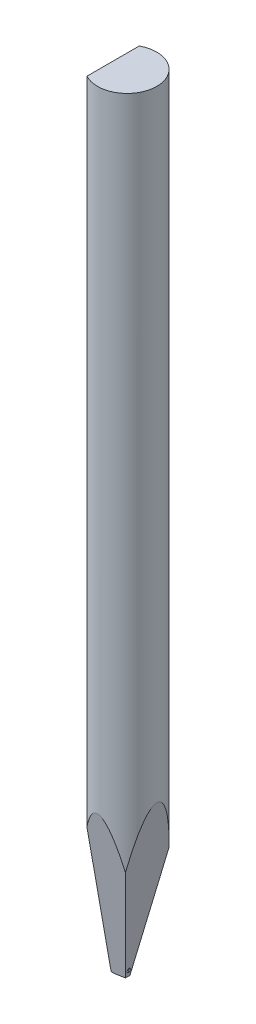
ISO-10303-21;
HEADER;
FILE_DESCRIPTION(('STEP AP214'),'2;1');
FILE_NAME('part.step','',(''),(''),'','','');
FILE_SCHEMA(('AUTOMOTIVE_DESIGN { 1 0 10303 214 1 1 1 1 }'));
ENDSEC;
DATA;
#1=APPLICATION_CONTEXT('core data for automotive mechanical design processes');
#2=APPLICATION_PROTOCOL_DEFINITION('international standard','automotive_design',2000,#1);
#3=PRODUCT_CONTEXT('',#1,'mechanical');
#4=PRODUCT('Part','Part','',(#3));
#5=PRODUCT_RELATED_PRODUCT_CATEGORY('part','',(#4));
#6=PRODUCT_DEFINITION_FORMATION('','',#4);
#7=PRODUCT_DEFINITION_CONTEXT('part definition',#1,'design');
#8=PRODUCT_DEFINITION('design','',#6,#7);
#9=PRODUCT_DEFINITION_SHAPE('','',#8);
#10=(LENGTH_UNIT() NAMED_UNIT(*) SI_UNIT(.MILLI.,.METRE.));
#11=(NAMED_UNIT(*) PLANE_ANGLE_UNIT() SI_UNIT($,.RADIAN.));
#12=(NAMED_UNIT(*) SI_UNIT($,.STERADIAN.) SOLID_ANGLE_UNIT());
#13=UNCERTAINTY_MEASURE_WITH_UNIT(LENGTH_MEASURE(1.E-05),#10,'distance_accuracy_value','');
#14=(GEOMETRIC_REPRESENTATION_CONTEXT(3) GLOBAL_UNCERTAINTY_ASSIGNED_CONTEXT((#13)) GLOBAL_UNIT_ASSIGNED_CONTEXT((#10,
#11,#12)) REPRESENTATION_CONTEXT('',''));
#15=CARTESIAN_POINT('',(0.,0.,0.));
#16=DIRECTION('',(0.,0.,1.));
#17=DIRECTION('',(1.,0.,0.));
#18=AXIS2_PLACEMENT_3D('',#15,#16,#17);
#19=CARTESIAN_POINT('',(26.8738719491216,0.,0.0508));
#20=DIRECTION('',(0.,-0.173648177666931,0.984807753012208));
#21=DIRECTION('',(0.,-0.984807753012208,-0.173648177666931));
#22=AXIS2_PLACEMENT_3D('',#19,#20,#21);
#23=PLANE('',#22);
#24=CARTESIAN_POINT('',(-0.35316,0.02286,0.0548308347789982));
#25=DIRECTION('',(0.,-0.173648177666931,0.984807753012208));
#26=DIRECTION('',(0.,-0.984807753012208,-0.173648177666931));
#27=AXIS2_PLACEMENT_3D('',#24,#25,#26);
#28=ELLIPSE('',#27,0.0232126523477082,0.02286);
#29=CARTESIAN_POINT('',(-0.353160000000002,0.,0.0507920612593779));
#30=VERTEX_POINT('',#29);
#31=CARTESIAN_POINT('',(-0.37592,0.0207241161080222,0.0544542208211788));
#32=VERTEX_POINT('',#31);
#33=EDGE_CURVE('E214',#30,#32,#28,.F.);
#34=ORIENTED_EDGE('',*,*,#33,.F.);
#35=CARTESIAN_POINT('',(-0.287020000000002,0.,0.0507841225187557));
#36=DIRECTION('',(-1.,0.,0.));
#37=VECTOR('',#36,1.);
#38=LINE('',#35,#37);
#39=CARTESIAN_POINT('',(-0.287019999999999,0.,0.0507920612593779));
#40=VERTEX_POINT('',#39);
#41=EDGE_CURVE('E241',#40,#30,#38,.T.);
#42=ORIENTED_EDGE('',*,*,#41,.F.);
#43=DIRECTION('',(-0.984346441568213,-0.173566836012845,-0.0306045161452665));
#44=VECTOR('',#43,1.);
#45=CARTESIAN_POINT('',(26.0301980698046,4.64043560289492,0.869033999030531));
#46=LINE('',#45,#44);
#47=CARTESIAN_POINT('',(0.0144531636701099,0.0531578527145794,0.060173163670107));
#48=VERTEX_POINT('',#47);
#49=EDGE_CURVE('E288',#48,#40,#46,.T.);
#50=ORIENTED_EDGE('',*,*,#49,.F.);
#51=DIRECTION('',(-0.171087869746036,-0.970287525247814,-0.171087869746036));
#52=VECTOR('',#51,1.);
#53=CARTESIAN_POINT('',(0.791557999082992,4.46033837772866,0.837277999082991));
#54=LINE('',#53,#52);
#55=CARTESIAN_POINT('',(0.537041505266774,3.0169036135559,0.582761505266773));
#56=VERTEX_POINT('',#55);
#57=EDGE_CURVE('E285',#56,#48,#54,.T.);
#58=ORIENTED_EDGE('',*,*,#57,.F.);
#59=CARTESIAN_POINT('',(0.,-0.288101116436578,0.));
#60=DIRECTION('',(0.,-0.173648177666931,0.984807753012208));
#61=DIRECTION('',(0.,-0.984807753012208,-0.173648177666931));
#62=AXIS2_PLACEMENT_3D('',#59,#60,#61);
#63=ELLIPSE('',#62,4.56371043248163,0.792479999999998);
#64=CARTESIAN_POINT('',(-0.37592,3.66844093071415,0.69764511322018));
#65=VERTEX_POINT('',#64);
#66=EDGE_CURVE('E289',#56,#65,#63,.T.);
#67=ORIENTED_EDGE('',*,*,#66,.T.);
#68=DIRECTION('',(0.,0.984807753012208,0.173648177666931));
#69=VECTOR('',#68,1.);
#70=CARTESIAN_POINT('',(-0.37592,20.251112252608,3.62161747949059));
#71=LINE('',#70,#69);
#72=EDGE_CURVE('E54',#32,#65,#71,.T.);
#73=ORIENTED_EDGE('',*,*,#72,.F.);
#74=EDGE_LOOP('',(#34,#42,#50,#58,#67,#73));
#75=FACE_BOUND('',#74,.T.);
#76=ADVANCED_FACE('F46',(#75),#23,.T.);
#77=CARTESIAN_POINT('',(26.8738719491216,0.,-0.0508));
#78=DIRECTION('',(0.,-0.173648177666931,-0.984807753012208));
#79=DIRECTION('',(0.,0.984807753012208,-0.173648177666931));
#80=AXIS2_PLACEMENT_3D('',#77,#78,#79);
#81=PLANE('',#80);
#82=CARTESIAN_POINT('',(-0.35316,0.02286,-0.0548308347789982));
#83=DIRECTION('',(0.,-0.173648177666931,-0.984807753012208));
#84=DIRECTION('',(0.,0.984807753012208,-0.173648177666931));
#85=AXIS2_PLACEMENT_3D('',#82,#83,#84);
#86=ELLIPSE('',#85,0.0232126523477082,0.02286);
#87=CARTESIAN_POINT('',(-0.37592,0.0207241161080222,-0.0544542208211793));
#88=VERTEX_POINT('',#87);
#89=CARTESIAN_POINT('',(-0.353160000000002,0.,-0.0507920612593779));
#90=VERTEX_POINT('',#89);
#91=EDGE_CURVE('E173',#88,#90,#86,.F.);
#92=ORIENTED_EDGE('',*,*,#91,.F.);
#93=DIRECTION('',(0.,-0.984807753012208,0.173648177666931));
#94=VECTOR('',#93,1.);
#95=CARTESIAN_POINT('',(-0.37592,20.5255765703836,-3.67001294395617));
#96=LINE('',#95,#94);
#97=CARTESIAN_POINT('',(-0.37592,3.66844093071414,-0.69764511322018));
#98=VERTEX_POINT('',#97);
#99=EDGE_CURVE('E168',#98,#88,#96,.T.);
#100=ORIENTED_EDGE('',*,*,#99,.F.);
#101=CARTESIAN_POINT('',(0.,-0.288101116436578,0.));
#102=DIRECTION('',(0.,-0.173648177666931,-0.984807753012208));
#103=DIRECTION('',(0.,-0.984807753012208,0.173648177666931));
#104=AXIS2_PLACEMENT_3D('',#101,#102,#103);
#105=ELLIPSE('',#104,4.56371043248163,0.792479999999998);
#106=CARTESIAN_POINT('',(0.537041505266774,3.0169036135559,-0.582761505266773));
#107=VERTEX_POINT('',#106);
#108=EDGE_CURVE('E292',#98,#107,#105,.T.);
#109=ORIENTED_EDGE('',*,*,#108,.T.);
#110=DIRECTION('',(0.171087869746036,0.970287525247814,-0.171087869746036));
#111=VECTOR('',#110,1.);
#112=CARTESIAN_POINT('',(0.791557999082992,4.46033837772866,-0.837277999082991));
#113=LINE('',#112,#111);
#114=CARTESIAN_POINT('',(0.0144531636701099,0.0531578527145794,-0.060173163670107));
#115=VERTEX_POINT('',#114);
#116=EDGE_CURVE('E303',#115,#107,#113,.T.);
#117=ORIENTED_EDGE('',*,*,#116,.F.);
#118=DIRECTION('',(0.984346441568213,0.173566836012845,-0.0306045161452665));
#119=VECTOR('',#118,1.);
#120=CARTESIAN_POINT('',(26.0301980698046,4.64043560289492,-0.869033999030531));
#121=LINE('',#120,#119);
#122=CARTESIAN_POINT('',(-0.287019999999999,0.,-0.0507920612593778));
#123=VERTEX_POINT('',#122);
#124=EDGE_CURVE('E306',#123,#115,#121,.T.);
#125=ORIENTED_EDGE('',*,*,#124,.F.);
#126=CARTESIAN_POINT('',(-0.287019999999996,0.,-0.0508000000000001));
#127=DIRECTION('',(-1.,0.,0.));
#128=VECTOR('',#127,1.);
#129=LINE('',#126,#128);
#130=EDGE_CURVE('E236',#123,#90,#129,.T.);
#131=ORIENTED_EDGE('',*,*,#130,.T.);
#132=EDGE_LOOP('',(#92,#100,#109,#117,#125,#131));
#133=FACE_BOUND('',#132,.T.);
#134=ADVANCED_FACE('F326',(#133),#81,.T.);
#135=CARTESIAN_POINT('',(0.,21.0312,0.));
#136=DIRECTION('',(0.,-1.,0.));
#137=DIRECTION('',(0.,0.,-1.));
#138=AXIS2_PLACEMENT_3D('',#135,#136,#137);
#139=CYLINDRICAL_SURFACE('',#138,0.792479999999998);
#140=ORIENTED_EDGE('',*,*,#66,.F.);
#141=CARTESIAN_POINT('',(0.,-0.0288101116436568,0.));
#142=DIRECTION('',(-0.984807753012208,0.173648177666931,0.));
#143=DIRECTION('',(-0.173648177666931,-0.984807753012208,0.));
#144=AXIS2_PLACEMENT_3D('',#141,#142,#143);
#145=ELLIPSE('',#144,4.56371043248164,0.792479999999998);
#146=EDGE_CURVE('E282',#56,#107,#145,.T.);
#147=ORIENTED_EDGE('',*,*,#146,.T.);
#148=ORIENTED_EDGE('',*,*,#108,.F.);
#149=DIRECTION('',(0.,-1.,0.));
#150=VECTOR('',#149,1.);
#151=CARTESIAN_POINT('',(-0.37592,21.0312,-0.69764511322018));
#152=LINE('',#151,#150);
#153=CARTESIAN_POINT('',(-0.37592,21.0312,-0.69764511322018));
#154=VERTEX_POINT('',#153);
#155=EDGE_CURVE('E298',#154,#98,#152,.T.);
#156=ORIENTED_EDGE('',*,*,#155,.F.);
#157=CARTESIAN_POINT('',(0.,21.0312,0.));
#158=DIRECTION('',(0.,1.,0.));
#159=DIRECTION('',(0.,0.,1.));
#160=AXIS2_PLACEMENT_3D('',#157,#158,#159);
#161=CIRCLE('',#160,0.792479999999998);
#162=CARTESIAN_POINT('',(-0.37592,21.0312,0.69764511322018));
#163=VERTEX_POINT('',#162);
#164=EDGE_CURVE('E300',#163,#154,#161,.T.);
#165=ORIENTED_EDGE('',*,*,#164,.F.);
#166=DIRECTION('',(0.,-1.,0.));
#167=VECTOR('',#166,1.);
#168=CARTESIAN_POINT('',(-0.37592,21.0312,0.69764511322018));
#169=LINE('',#168,#167);
#170=EDGE_CURVE('E296',#65,#163,#169,.F.);
#171=ORIENTED_EDGE('',*,*,#170,.F.);
#172=EDGE_LOOP('',(#140,#147,#148,#156,#165,#171));
#173=FACE_BOUND('',#172,.T.);
#174=ADVANCED_FACE('F336',(#173),#139,.T.);
#175=CARTESIAN_POINT('',(-0.37592,21.0312,-0.80247998));
#176=DIRECTION('',(-1.,0.,0.));
#177=DIRECTION('',(0.,0.,1.));
#178=AXIS2_PLACEMENT_3D('',#175,#176,#177);
#179=PLANE('',#178);
#180=CARTESIAN_POINT('',(-0.37592,0.,0.0507841225187557));
#181=CARTESIAN_POINT('',(-0.37592,0.0124912996373636,0.0356119424462526));
#182=CARTESIAN_POINT('',(-0.37592,0.0241300000000007,0.0180052989584167));
#183=CARTESIAN_POINT('',(-0.37592,0.0241300000000007,-0.0180052989584167));
#184=CARTESIAN_POINT('',(-0.37592,0.0124912996373624,-0.0356119424462515));
#185=CARTESIAN_POINT('',(-0.37592,0.,-0.0507841225187556));
#186=(BOUNDED_CURVE() B_SPLINE_CURVE(3,(#180,#181,#182,#183,#184,#185),.UNSPECIFIED.,.F.,
.F.) B_SPLINE_CURVE_WITH_KNOTS((4,2,4),(1.42102999679081,1.5707963267949,1.72056265679899),
.UNSPECIFIED.) CURVE() GEOMETRIC_REPRESENTATION_ITEM() RATIONAL_B_SPLINE_CURVE((1.,1.,1.,1.,1.,1.)) REPRESENTATION_ITEM(''));
#187=CARTESIAN_POINT('',(-0.375960904167992,0.0219255780743327,-0.0173369868293132));
#188=VERTEX_POINT('',#187);
#189=CARTESIAN_POINT('',(-0.375954799312249,0.0218254793366599,0.0175308964824427));
#190=VERTEX_POINT('',#189);
#191=EDGE_CURVE('E155',#188,#190,#186,.F.);
#192=ORIENTED_EDGE('',*,*,#191,.T.);
#193=DIRECTION('',(0.,0.,-1.));
#194=VECTOR('',#193,1.);
#195=CARTESIAN_POINT('',(-0.37592,0.0207241161080225,27.1393987062344));
#196=LINE('',#195,#194);
#197=EDGE_CURVE('E69',#32,#190,#196,.T.);
#198=ORIENTED_EDGE('',*,*,#197,.F.);
#199=ORIENTED_EDGE('',*,*,#72,.T.);
#200=ORIENTED_EDGE('',*,*,#170,.T.);
#201=DIRECTION('',(0.,0.,-1.));
#202=VECTOR('',#201,1.);
#203=CARTESIAN_POINT('',(-0.37592,21.0312,-0.80247998));
#204=LINE('',#203,#202);
#205=EDGE_CURVE('E294',#163,#154,#204,.T.);
#206=ORIENTED_EDGE('',*,*,#205,.T.);
#207=ORIENTED_EDGE('',*,*,#155,.T.);
#208=ORIENTED_EDGE('',*,*,#99,.T.);
#209=EDGE_CURVE('E165',#188,#88,#196,.T.);
#210=ORIENTED_EDGE('',*,*,#209,.F.);
#211=EDGE_LOOP('',(#192,#198,#199,#200,#206,#207,#208,#210));
#212=FACE_BOUND('',#211,.T.);
#213=ADVANCED_FACE('F166',(#212),#179,.T.);
#214=CARTESIAN_POINT('',(0.,21.0312,0.));
#215=DIRECTION('',(0.,1.,0.));
#216=DIRECTION('',(0.,0.,1.));
#217=AXIS2_PLACEMENT_3D('',#214,#215,#216);
#218=PLANE('',#217);
#219=ORIENTED_EDGE('',*,*,#164,.T.);
#220=ORIENTED_EDGE('',*,*,#205,.F.);
#221=EDGE_LOOP('',(#219,#220));
#222=FACE_BOUND('',#221,.T.);
#223=ADVANCED_FACE('F342',(#222),#218,.T.);
#224=CARTESIAN_POINT('',(-0.28702,0.,27.2760283406468));
#225=DIRECTION('',(-0.173648177666931,0.984807753012208,0.));
#226=DIRECTION('',(-0.984807753012208,-0.173648177666931,0.));
#227=AXIS2_PLACEMENT_3D('',#224,#225,#226);
#228=PLANE('',#227);
#229=ORIENTED_EDGE('',*,*,#49,.T.);
#230=CARTESIAN_POINT('',(-2.19568989639233,-0.33655,0.));
#231=DIRECTION('',(-0.173648177666931,0.984807753012208,0.));
#232=DIRECTION('',(-0.984807753012208,-0.173648177666931,0.));
#233=AXIS2_PLACEMENT_3D('',#230,#231,#232);
#234=ELLIPSE('',#233,1.96005512164276,0.34036);
#235=CARTESIAN_POINT('',(-0.272227206716973,0.00260836857582131,0.0285749999999997));
#236=VERTEX_POINT('',#235);
#237=EDGE_CURVE('E247',#40,#236,#234,.T.);
#238=ORIENTED_EDGE('',*,*,#237,.T.);
#239=DIRECTION('',(-0.984807753012208,-0.173648177666931,0.));
#240=VECTOR('',#239,1.);
#241=CARTESIAN_POINT('',(-0.28702,0.,0.0285749999999994));
#242=LINE('',#241,#240);
#243=CARTESIAN_POINT('',(-0.127,0.0282158434529687,0.0285749999999997));
#244=VERTEX_POINT('',#243);
#245=EDGE_CURVE('E314',#244,#236,#242,.T.);
#246=ORIENTED_EDGE('',*,*,#245,.F.);
#247=DIRECTION('',(0.,0.,1.));
#248=VECTOR('',#247,1.);
#249=CARTESIAN_POINT('',(-0.127,0.0282158434529687,27.2760283406468));
#250=LINE('',#249,#248);
#251=CARTESIAN_POINT('',(-0.127,0.0282158434529687,-0.0285749999999997));
#252=VERTEX_POINT('',#251);
#253=EDGE_CURVE('E312',#252,#244,#250,.T.);
#254=ORIENTED_EDGE('',*,*,#253,.F.);
#255=DIRECTION('',(-0.984807753012208,-0.173648177666931,0.));
#256=VECTOR('',#255,1.);
#257=CARTESIAN_POINT('',(-0.28702,0.,-0.0285749999999994));
#258=LINE('',#257,#256);
#259=CARTESIAN_POINT('',(-0.272227206716973,0.00260836857582131,-0.0285749999999997));
#260=VERTEX_POINT('',#259);
#261=EDGE_CURVE('E309',#252,#260,#258,.T.);
#262=ORIENTED_EDGE('',*,*,#261,.T.);
#263=EDGE_CURVE('E221',#260,#123,#234,.T.);
#264=ORIENTED_EDGE('',*,*,#263,.T.);
#265=ORIENTED_EDGE('',*,*,#124,.T.);
#266=DIRECTION('',(0.,0.,-1.));
#267=VECTOR('',#266,1.);
#268=CARTESIAN_POINT('',(0.014453163670107,0.0531578527145792,27.2760283406468));
#269=LINE('',#268,#267);
#270=EDGE_CURVE('E279',#48,#115,#269,.T.);
#271=ORIENTED_EDGE('',*,*,#270,.F.);
#272=EDGE_LOOP('',(#229,#238,#246,#254,#262,#264,#265,#271));
#273=FACE_BOUND('',#272,.T.);
#274=ADVANCED_FACE('F503',(#273),#228,.F.);
#275=CARTESIAN_POINT('',(0.014453163670107,0.0531578527145792,27.2760283406468));
#276=DIRECTION('',(-0.984807753012208,0.173648177666931,0.));
#277=DIRECTION('',(-0.173648177666931,-0.984807753012208,0.));
#278=AXIS2_PLACEMENT_3D('',#275,#276,#277);
#279=PLANE('',#278);
#280=CARTESIAN_POINT('',(0.042417493302163,0.211751446954655,0.));
#281=DIRECTION('',(-0.984807753012208,0.173648177666931,0.));
#282=DIRECTION('',(0.173648177666931,0.984807753012208,0.));
#283=AXIS2_PLACEMENT_3D('',#280,#281,#282);
#284=ELLIPSE('',#283,0.0566555398592854,0.0406948626453099);
#285=CARTESIAN_POINT('',(0.052255624553464,0.267546261859171,0.));
#286=VERTEX_POINT('',#285);
#287=EDGE_CURVE('E277',#286,#286,#284,.F.);
#288=ORIENTED_EDGE('',*,*,#287,.F.);
#289=EDGE_LOOP('',(#288));
#290=FACE_BOUND('',#289,.T.);
#291=ORIENTED_EDGE('',*,*,#146,.F.);
#292=ORIENTED_EDGE('',*,*,#57,.T.);
#293=ORIENTED_EDGE('',*,*,#270,.T.);
#294=ORIENTED_EDGE('',*,*,#116,.T.);
#295=EDGE_LOOP('',(#291,#292,#293,#294));
#296=FACE_BOUND('',#295,.T.);
#297=ADVANCED_FACE('F499',(#290,#296),#279,.F.);
#298=CARTESIAN_POINT('',(-0.22877858413363,0.0965200000000001,0.));
#299=DIRECTION('',(-0.500000000000004,-0.866025403784436,0.));
#300=DIRECTION('',(0.866025403784436,-0.500000000000004,0.));
#301=AXIS2_PLACEMENT_3D('',#298,#299,#300);
#302=CYLINDRICAL_SURFACE('',#301,0.028575);
#303=DIRECTION('',(-0.500000000000004,-0.866025403784436,0.));
#304=VECTOR('',#303,1.);
#305=CARTESIAN_POINT('',(-0.213378324086859,0.12319403285078,0.028575));
#306=LINE('',#305,#304);
#307=CARTESIAN_POINT('',(-0.22877858413363,0.0965200000000001,0.028575));
#308=VERTEX_POINT('',#307);
#309=CARTESIAN_POINT('',(-0.282998489816425,0.00260836857580754,0.028575));
#310=VERTEX_POINT('',#309);
#311=EDGE_CURVE('E274',#308,#310,#306,.T.);
#312=ORIENTED_EDGE('',*,*,#311,.T.);
#313=CARTESIAN_POINT('',(-0.282998489816427,0.00260836857580264,-0.028575));
#314=CARTESIAN_POINT('',(-0.291057954934873,0.00727750260510659,-0.0285750000000002));
#315=CARTESIAN_POINT('',(-0.297553297601773,0.00979968639561033,-0.0246185446540711));
#316=CARTESIAN_POINT('',(-0.306882221783249,0.0131243082575393,-0.0139838160543526));
#317=CARTESIAN_POINT('',(-0.309458673133645,0.0139673876968948,-0.00698118055188267));
#318=CARTESIAN_POINT('',(-0.309409884530429,0.0139726401064735,0.00714153323061982));
#319=CARTESIAN_POINT('',(-0.30680470638007,0.0131325634305108,0.0140922105999724));
#320=CARTESIAN_POINT('',(-0.297454069961335,0.00980772083814176,0.0246677652429086));
#321=CARTESIAN_POINT('',(-0.291024965217658,0.00726516076959005,0.0285750000000008));
#322=CARTESIAN_POINT('',(-0.282998489816425,0.00260836857580259,0.028575));
#323=(BOUNDED_CURVE() B_SPLINE_CURVE(3,(#313,#314,#315,#316,#317,#318,#319,#320,#321,#322),
.UNSPECIFIED.,.F.,.F.) B_SPLINE_CURVE_WITH_KNOTS((4,2,2,2,4),(0.,2.38139585135671E-05,
4.76279170271342E-05,7.14418755407013E-05,9.52558340542684E-05),
.UNSPECIFIED.) CURVE() GEOMETRIC_REPRESENTATION_ITEM() RATIONAL_B_SPLINE_CURVE((1.,1.,1.,1.,1.,
1.,1.,1.,1.,1.)) REPRESENTATION_ITEM(''));
#324=CARTESIAN_POINT('',(-0.282998489816422,0.00260836857580448,-0.028575));
#325=VERTEX_POINT('',#324);
#326=EDGE_CURVE('E369',#310,#325,#323,.F.);
#327=ORIENTED_EDGE('',*,*,#326,.T.);
#328=DIRECTION('',(0.500000000000004,0.866025403784436,0.));
#329=VECTOR('',#328,1.);
#330=CARTESIAN_POINT('',(-0.22877858413363,0.0965200000000001,-0.028575));
#331=LINE('',#330,#329);
#332=CARTESIAN_POINT('',(-0.22877858413363,0.0965200000000001,-0.028575));
#333=VERTEX_POINT('',#332);
#334=EDGE_CURVE('E278',#325,#333,#331,.T.);
#335=ORIENTED_EDGE('',*,*,#334,.T.);
#336=CARTESIAN_POINT('',(-0.22877858413363,0.0965200000000001,0.));
#337=DIRECTION('',(0.,-1.,0.));
#338=DIRECTION('',(-1.,0.,0.));
#339=AXIS2_PLACEMENT_3D('',#336,#337,#338);
#340=ELLIPSE('',#339,0.0329955678841872,0.028575);
#341=EDGE_CURVE('E275',#333,#308,#340,.F.);
#342=ORIENTED_EDGE('',*,*,#341,.T.);
#343=EDGE_LOOP('',(#312,#327,#335,#342));
#344=FACE_BOUND('',#343,.T.);
#345=ADVANCED_FACE('F486',(#344),#302,.F.);
#346=CARTESIAN_POINT('',(-0.127,0.0965200000000001,0.028575));
#347=DIRECTION('',(-1.,0.,0.));
#348=DIRECTION('',(0.,0.,1.));
#349=AXIS2_PLACEMENT_3D('',#346,#347,#348);
#350=PLANE('',#349);
#351=ORIENTED_EDGE('',*,*,#253,.T.);
#352=DIRECTION('',(0.,1.,0.));
#353=VECTOR('',#352,1.);
#354=CARTESIAN_POINT('',(-0.127,0.0965200000000001,0.028575));
#355=LINE('',#354,#353);
#356=CARTESIAN_POINT('',(-0.127,0.0965200000000001,0.028575));
#357=VERTEX_POINT('',#356);
#358=EDGE_CURVE('E264',#244,#357,#355,.T.);
#359=ORIENTED_EDGE('',*,*,#358,.T.);
#360=DIRECTION('',(0.,0.,-1.));
#361=VECTOR('',#360,1.);
#362=CARTESIAN_POINT('',(-0.127,0.0965200000000001,0.028575));
#363=LINE('',#362,#361);
#364=CARTESIAN_POINT('',(-0.127,0.0965200000000001,0.0254));
#365=VERTEX_POINT('',#364);
#366=EDGE_CURVE('E271',#357,#365,#363,.T.);
#367=ORIENTED_EDGE('',*,*,#366,.T.);
#368=CARTESIAN_POINT('',(-0.127,0.09652,0.));
#369=DIRECTION('',(1.,0.,0.));
#370=DIRECTION('',(0.,1.,0.));
#371=AXIS2_PLACEMENT_3D('',#368,#369,#370);
#372=ELLIPSE('',#371,0.0293293936748329,0.0254);
#373=CARTESIAN_POINT('',(-0.127,0.0965200000000001,-0.0253999999999983));
#374=VERTEX_POINT('',#373);
#375=EDGE_CURVE('E257',#374,#365,#372,.F.);
#376=ORIENTED_EDGE('',*,*,#375,.F.);
#377=CARTESIAN_POINT('',(-0.127,0.0965200000000001,-0.028575));
#378=VERTEX_POINT('',#377);
#379=EDGE_CURVE('E267',#374,#378,#363,.T.);
#380=ORIENTED_EDGE('',*,*,#379,.T.);
#381=DIRECTION('',(0.,1.,0.));
#382=VECTOR('',#381,1.);
#383=CARTESIAN_POINT('',(-0.127,0.0965200000000001,-0.028575));
#384=LINE('',#383,#382);
#385=EDGE_CURVE('E265',#252,#378,#384,.T.);
#386=ORIENTED_EDGE('',*,*,#385,.F.);
#387=EDGE_LOOP('',(#351,#359,#367,#376,#380,#386));
#388=FACE_BOUND('',#387,.T.);
#389=ADVANCED_FACE('F498',(#388),#350,.T.);
#390=CARTESIAN_POINT('',(0.,0.,0.028575));
#391=DIRECTION('',(0.,0.,-1.));
#392=DIRECTION('',(-1.,0.,0.));
#393=AXIS2_PLACEMENT_3D('',#390,#391,#392);
#394=PLANE('',#393);
#395=DIRECTION('',(-1.,0.,0.));
#396=VECTOR('',#395,1.);
#397=CARTESIAN_POINT('',(26.7627469491216,0.00260836857580255,0.028575));
#398=LINE('',#397,#396);
#399=EDGE_CURVE('E244',#310,#236,#398,.F.);
#400=ORIENTED_EDGE('',*,*,#399,.F.);
#401=ORIENTED_EDGE('',*,*,#311,.F.);
#402=DIRECTION('',(-1.,0.,0.));
#403=VECTOR('',#402,1.);
#404=CARTESIAN_POINT('',(-0.261774152017817,0.0965200000000001,0.028575));
#405=LINE('',#404,#403);
#406=EDGE_CURVE('E261',#357,#308,#405,.T.);
#407=ORIENTED_EDGE('',*,*,#406,.F.);
#408=ORIENTED_EDGE('',*,*,#358,.F.);
#409=ORIENTED_EDGE('',*,*,#245,.T.);
#410=EDGE_LOOP('',(#400,#401,#407,#408,#409));
#411=FACE_BOUND('',#410,.T.);
#412=ADVANCED_FACE('F531',(#411),#394,.T.);
#413=CARTESIAN_POINT('',(0.,0.,-0.028575));
#414=DIRECTION('',(0.,0.,-1.));
#415=DIRECTION('',(-1.,0.,0.));
#416=AXIS2_PLACEMENT_3D('',#413,#414,#415);
#417=PLANE('',#416);
#418=ORIENTED_EDGE('',*,*,#334,.F.);
#419=DIRECTION('',(-1.,0.,0.));
#420=VECTOR('',#419,1.);
#421=CARTESIAN_POINT('',(26.7627469491216,0.00260836857580255,-0.028575));
#422=LINE('',#421,#420);
#423=EDGE_CURVE('E317',#325,#260,#422,.F.);
#424=ORIENTED_EDGE('',*,*,#423,.T.);
#425=ORIENTED_EDGE('',*,*,#261,.F.);
#426=ORIENTED_EDGE('',*,*,#385,.T.);
#427=DIRECTION('',(-1.,0.,0.));
#428=VECTOR('',#427,1.);
#429=CARTESIAN_POINT('',(-0.261774152017817,0.0965200000000001,-0.028575));
#430=LINE('',#429,#428);
#431=EDGE_CURVE('E260',#378,#333,#430,.T.);
#432=ORIENTED_EDGE('',*,*,#431,.T.);
#433=EDGE_LOOP('',(#418,#424,#425,#426,#432));
#434=FACE_BOUND('',#433,.T.);
#435=ADVANCED_FACE('F521',(#434),#417,.F.);
#436=CARTESIAN_POINT('',(0.0123245522071936,0.176959067721546,0.));
#437=DIRECTION('',(0.866025403784441,0.499999999999995,0.));
#438=DIRECTION('',(-0.499999999999995,0.866025403784441,0.));
#439=AXIS2_PLACEMENT_3D('',#436,#437,#438);
#440=CONICAL_SURFACE('',#439,0.0254,0.392699081698725);
#441=CARTESIAN_POINT('',(0.0123245522071936,0.176959067721546,0.));
#442=DIRECTION('',(0.866025403784441,0.499999999999995,0.));
#443=DIRECTION('',(-0.499999999999995,0.866025403784441,0.));
#444=AXIS2_PLACEMENT_3D('',#441,#442,#443);
#445=CIRCLE('',#444,0.0254);
#446=CARTESIAN_POINT('',(-0.000375447792806306,0.198956112977671,0.));
#447=VERTEX_POINT('',#446);
#448=EDGE_CURVE('E251',#447,#447,#445,.T.);
#449=ORIENTED_EDGE('',*,*,#448,.F.);
#450=EDGE_LOOP('',(#449));
#451=FACE_BOUND('',#450,.T.);
#452=ORIENTED_EDGE('',*,*,#287,.T.);
#453=EDGE_LOOP('',(#452));
#454=FACE_BOUND('',#453,.T.);
#455=ADVANCED_FACE('F543',(#451,#454),#440,.F.);
#456=CARTESIAN_POINT('',(-0.261774152017817,0.0965200000000001,0.028575));
#457=DIRECTION('',(0.,-1.,0.));
#458=DIRECTION('',(0.,0.,-1.));
#459=AXIS2_PLACEMENT_3D('',#456,#457,#458);
#460=PLANE('',#459);
#461=ORIENTED_EDGE('',*,*,#431,.F.);
#462=ORIENTED_EDGE('',*,*,#379,.F.);
#463=CARTESIAN_POINT('',(-0.127,0.0965200000000001,0.));
#464=DIRECTION('',(0.,1.,0.));
#465=DIRECTION('',(1.,0.,0.));
#466=AXIS2_PLACEMENT_3D('',#463,#464,#465);
#467=ELLIPSE('',#466,0.0508000000000004,0.0254);
#468=EDGE_CURVE('E254',#365,#374,#467,.F.);
#469=ORIENTED_EDGE('',*,*,#468,.F.);
#470=ORIENTED_EDGE('',*,*,#366,.F.);
#471=ORIENTED_EDGE('',*,*,#406,.T.);
#472=ORIENTED_EDGE('',*,*,#341,.F.);
#473=EDGE_LOOP('',(#461,#462,#469,#470,#471,#472));
#474=FACE_BOUND('',#473,.T.);
#475=ADVANCED_FACE('F500',(#474),#460,.T.);
#476=CARTESIAN_POINT('',(-0.38750310314659,-0.0538815367264147,0.));
#477=DIRECTION('',(0.866025403784441,0.499999999999995,0.));
#478=DIRECTION('',(-0.499999999999995,0.866025403784441,0.));
#479=AXIS2_PLACEMENT_3D('',#476,#477,#478);
#480=CYLINDRICAL_SURFACE('',#479,0.0254);
#481=ORIENTED_EDGE('',*,*,#375,.T.);
#482=ORIENTED_EDGE('',*,*,#468,.T.);
#483=EDGE_LOOP('',(#481,#482));
#484=FACE_BOUND('',#483,.T.);
#485=ORIENTED_EDGE('',*,*,#448,.T.);
#486=EDGE_LOOP('',(#485));
#487=FACE_BOUND('',#486,.T.);
#488=ADVANCED_FACE('F537',(#484,#487),#480,.F.);
#489=CARTESIAN_POINT('',(26.7627469491216,-0.33655,0.));
#490=DIRECTION('',(-1.,0.,0.));
#491=DIRECTION('',(0.,0.,1.));
#492=AXIS2_PLACEMENT_3D('',#489,#490,#491);
#493=CYLINDRICAL_SURFACE('',#492,0.34036);
#494=ORIENTED_EDGE('',*,*,#41,.T.);
#495=CARTESIAN_POINT('',(-0.35316,0.,0.0507841225187487));
#496=CARTESIAN_POINT('',(-0.353373732251372,-9.9345582125882E-08,0.0507847439070903));
#497=CARTESIAN_POINT('',(-0.353586598537425,2.9933462318433E-06,0.0507642873292754));
#498=CARTESIAN_POINT('',(-0.354002742092885,1.46301891653247E-05,0.0506870964390786));
#499=CARTESIAN_POINT('',(-0.354206108342231,2.31025416714583E-05,0.0506308399024754));
#500=CARTESIAN_POINT('',(-0.354656535219782,4.76179327962753E-05,0.0504676252112719));
#501=CARTESIAN_POINT('',(-0.354899897489881,6.51160825404775E-05,0.0503508841630334));
#502=CARTESIAN_POINT('',(-0.355365694595863,0.000105452460850597,0.0500804851487046));
#503=CARTESIAN_POINT('',(-0.355588001118319,0.000128320802153074,0.0499266188682787));
#504=CARTESIAN_POINT('',(-0.356167445330495,0.000195645530246311,0.0494710360603362));
#505=CARTESIAN_POINT('',(-0.356503754728676,0.00024362549723817,0.0491437041807785));
#506=CARTESIAN_POINT('',(-0.357126804482206,0.000344632628413951,0.0484465068439318));
#507=CARTESIAN_POINT('',(-0.357413434035267,0.000397670675827903,0.0480765492983261));
#508=CARTESIAN_POINT('',(-0.358478057636995,0.000611918919671937,0.0465623363900981));
#509=CARTESIAN_POINT('',(-0.359116311865306,0.000781127617140636,0.0453235022218624));
#510=CARTESIAN_POINT('',(-0.360230597221551,0.00111402197564509,0.042774553102763));
#511=CARTESIAN_POINT('',(-0.360705465248353,0.00127766085635154,0.0414640010669976));
#512=CARTESIAN_POINT('',(-0.362684568080408,0.0020081188208258,0.0353085475165155));
#513=CARTESIAN_POINT('',(-0.363595230582203,0.00249838071774296,0.0302703322572376));
#514=CARTESIAN_POINT('',(-0.364923321586658,0.00325235849537647,0.020141907139426));
#515=CARTESIAN_POINT('',(-0.365340089826931,0.00351577098433968,0.0150516368339619));
#516=CARTESIAN_POINT('',(-0.365878267938912,0.00385767780351296,0.00332616977081136));
#517=CARTESIAN_POINT('',(-0.365875430768373,0.00385816517747613,-0.00331950750880195));
#518=CARTESIAN_POINT('',(-0.365366639149005,0.00353105773718187,-0.0145204520289741));
#519=CARTESIAN_POINT('',(-0.365016484477494,0.00330483640163298,-0.019086857749717));
#520=CARTESIAN_POINT('',(-0.36407840338286,0.00277102331687769,-0.026759049778636));
#521=CARTESIAN_POINT('',(-0.36359728865163,0.00251012962693596,-0.0298804408246669));
#522=CARTESIAN_POINT('',(-0.362524530272293,0.00200013822946934,-0.0351192845198816));
#523=CARTESIAN_POINT('',(-0.362011133605511,0.00177163215710648,-0.0372530605981551));
#524=CARTESIAN_POINT('',(-0.360932418030966,0.00135694241051406,-0.0408173817217836));
#525=CARTESIAN_POINT('',(-0.360428019903359,0.00117840123560602,-0.0422682298446862));
#526=CARTESIAN_POINT('',(-0.359184244140823,0.000796369329998768,-0.0452175970915375));
#527=CARTESIAN_POINT('',(-0.358429807165561,0.000592015364295269,-0.046711233260249));
#528=CARTESIAN_POINT('',(-0.357239309854852,0.000366162246898982,-0.048296030820931));
#529=CARTESIAN_POINT('',(-0.357033326137489,0.000329480471812337,-0.0485510884269556));
#530=CARTESIAN_POINT('',(-0.356595963389539,0.000258571889497027,-0.0490405428510718));
#531=CARTESIAN_POINT('',(-0.356364510869427,0.00022435268408738,-0.0492748761646582));
#532=CARTESIAN_POINT('',(-0.355868337270201,0.000159605918410828,-0.049715405864434));
#533=CARTESIAN_POINT('',(-0.355603143126216,0.000129146188242266,-0.0499210920432127));
#534=CARTESIAN_POINT('',(-0.355040250662018,7.57279632840068E-05,-0.050280029959809));
#535=CARTESIAN_POINT('',(-0.354742858691519,5.27058583383511E-05,-0.0504337268986214));
#536=CARTESIAN_POINT('',(-0.354229464405265,2.41515479786925E-05,-0.0506238713433833));
#537=CARTESIAN_POINT('',(-0.35402202926594,1.53119510561065E-05,-0.0506825715908233));
#538=CARTESIAN_POINT('',(-0.353596797994717,3.13995531593212E-06,-0.0507633158270858));
#539=CARTESIAN_POINT('',(-0.353378891319249,-1.05274283725804E-07,-0.0507847796446884));
#540=CARTESIAN_POINT('',(-0.353160000019582,-5.2931626408195E-12,-0.0507841225707873));
#541=B_SPLINE_CURVE_WITH_KNOTS('',3,(#495,#496,#497,#498,#499,#500,#501,#502,#503,#504,#505,
#506,#507,#508,#509,#510,#511,#512,#513,#514,#515,#516,#517,#518,#519,#520,#521,#522,#523,#524,
#525,#526,#527,#528,#529,#530,#531,#532,#533,#534,#535,#536,#537,#538,#539,#540),.UNSPECIFIED.,
.F.,.F.,(4,2,2,2,2,2,2,2,2,2,2,2,2,2,2,2,2,2,2,2,2,2,4),(0.,0.000638802240630786,
0.00126925305763175,0.00207613009026001,0.00288764443873067,0.00429491791191493,
0.00570529076795616,0.00988377805642201,0.0140914235654482,0.0294114096160041,
0.0447518531638898,0.0646417067345851,0.0783830095080341,0.0878810608792403,0.0944873828847801,
0.0991276753758563,0.104123988154376,0.105112374065861,0.1061036906753,0.107110869108363,
0.108109190431913,0.108753248673409,0.109407254603344),.UNSPECIFIED.);
#542=CARTESIAN_POINT('',(-0.36366346878511,0.00256366392580253,0.0290966972665005));
#543=VERTEX_POINT('',#542);
#544=EDGE_CURVE('E172',#30,#543,#541,.T.);
#545=ORIENTED_EDGE('',*,*,#544,.T.);
#546=CARTESIAN_POINT('',(-0.37592,0.,-0.0507841225187556));
#547=CARTESIAN_POINT('',(-0.365758080833375,0.00253508631817922,-0.0339839247784472));
#548=CARTESIAN_POINT('',(-0.355599999999994,0.00380999999999997,-0.0169914649143359));
#549=CARTESIAN_POINT('',(-0.355599999999994,0.00380999999999996,0.0169914649143359));
#550=CARTESIAN_POINT('',(-0.365758080833375,0.00253508631817924,0.0339839247784471));
#551=CARTESIAN_POINT('',(-0.37592,0.,0.0507841225187557));
#552=(BOUNDED_CURVE() B_SPLINE_CURVE(3,(#546,#547,#548,#549,#550,#551),.UNSPECIFIED.,.F.,
.F.) B_SPLINE_CURVE_WITH_KNOTS((4,2,4),(1.42102999679081,1.5707963267949,1.72056265679899),
.UNSPECIFIED.) CURVE() GEOMETRIC_REPRESENTATION_ITEM() RATIONAL_B_SPLINE_CURVE((1.,1.,1.,1.,1.,1.)) REPRESENTATION_ITEM(''));
#553=CARTESIAN_POINT('',(-0.363663424344935,0.00256366234237023,-0.029096715743886));
#554=VERTEX_POINT('',#553);
#555=EDGE_CURVE('E161',#543,#554,#552,.F.);
#556=ORIENTED_EDGE('',*,*,#555,.T.);
#557=EDGE_CURVE('E177',#554,#90,#541,.T.);
#558=ORIENTED_EDGE('',*,*,#557,.T.);
#559=ORIENTED_EDGE('',*,*,#130,.F.);
#560=ORIENTED_EDGE('',*,*,#263,.F.);
#561=ORIENTED_EDGE('',*,*,#423,.F.);
#562=CARTESIAN_POINT('',(-0.282998489816425,0.00260836857580259,0.028575));
#563=CARTESIAN_POINT('',(-0.29102255863418,0.00221755981884332,0.0332135322987013));
#564=CARTESIAN_POINT('',(-0.30185650357803,0.0022400805970294,0.0330958620083343));
#565=CARTESIAN_POINT('',(-0.320183586112597,0.00311904698396301,0.0223381582503345));
#566=CARTESIAN_POINT('',(-0.326994835670755,0.00380563943309761,0.0115288461768746));
#567=CARTESIAN_POINT('',(-0.327068855863113,0.00381431132404127,-0.0112699230251986));
#568=CARTESIAN_POINT('',(-0.320296392575128,0.00313056384670817,-0.0221747468136123));
#569=CARTESIAN_POINT('',(-0.301981797844341,0.00224694405598332,-0.0330338546009608));
#570=CARTESIAN_POINT('',(-0.291059100214688,0.00221626932534044,-0.0332288492425721));
#571=CARTESIAN_POINT('',(-0.282998489816427,0.00260836857580264,-0.028575));
#572=(BOUNDED_CURVE() B_SPLINE_CURVE(3,(#562,#563,#564,#565,#566,#567,#568,#569,#570,#571),
.UNSPECIFIED.,.F.,.F.) B_SPLINE_CURVE_WITH_KNOTS((4,2,2,2,4),(0.,2.38139585135671E-05,
4.76279170271342E-05,7.14418755407013E-05,9.52558340542684E-05),
.UNSPECIFIED.) CURVE() GEOMETRIC_REPRESENTATION_ITEM() RATIONAL_B_SPLINE_CURVE((1.,1.,1.,1.,1.,
1.,1.,1.,1.,1.)) REPRESENTATION_ITEM(''));
#573=EDGE_CURVE('E368',#325,#310,#572,.F.);
#574=ORIENTED_EDGE('',*,*,#573,.T.);
#575=ORIENTED_EDGE('',*,*,#399,.T.);
#576=ORIENTED_EDGE('',*,*,#237,.F.);
#577=EDGE_LOOP('',(#494,#545,#556,#558,#559,#560,#561,#574,#575,#576));
#578=FACE_BOUND('',#577,.T.);
#579=ADVANCED_FACE('F190',(#578),#493,.F.);
#580=CARTESIAN_POINT('',(-0.282998489816425,0.00260836857580259,0.028575));
#581=CARTESIAN_POINT('',(-0.291024965217658,0.00726516076959005,0.0285750000000008));
#582=CARTESIAN_POINT('',(-0.297454069961335,0.00980772083814176,0.0246677652429086));
#583=CARTESIAN_POINT('',(-0.30680470638007,0.0131325634305108,0.0140922105999724));
#584=CARTESIAN_POINT('',(-0.309409884530429,0.0139726401064735,0.00714153323061982));
#585=CARTESIAN_POINT('',(-0.309458673133645,0.0139673876968948,-0.00698118055188267));
#586=CARTESIAN_POINT('',(-0.306882221783249,0.0131243082575393,-0.0139838160543526));
#587=CARTESIAN_POINT('',(-0.297553297601773,0.00979968639561033,-0.0246185446540711));
#588=CARTESIAN_POINT('',(-0.291057954934873,0.00727750260510659,-0.0285750000000002));
#589=CARTESIAN_POINT('',(-0.282998489816427,0.00260836857580264,-0.028575));
#590=CARTESIAN_POINT('',(-0.282998489816425,0.00260836857580259,0.028575));
#591=CARTESIAN_POINT('',(-0.290256962758143,0.00260876055560382,0.0285741662095657));
#592=CARTESIAN_POINT('',(-0.298361929050095,0.00287957069673183,0.0265346542955306));
#593=CARTESIAN_POINT('',(-0.310904887738004,0.003500595847221,0.0164549899921433));
#594=CARTESIAN_POINT('',(-0.315270052831379,0.00380799896315155,0.0083748538469757));
#595=CARTESIAN_POINT('',(-0.315330198104895,0.0038119785269261,-0.00818587207914023));
#596=CARTESIAN_POINT('',(-0.310998778864618,0.00350612718148821,-0.0163355095917579));
#597=CARTESIAN_POINT('',(-0.298471776178693,0.00288331781779211,-0.0264894153475499));
#598=CARTESIAN_POINT('',(-0.290288305336967,0.00260871264191725,-0.0285747525397327));
#599=CARTESIAN_POINT('',(-0.282998489816427,0.00260836857580264,-0.028575));
#600=CARTESIAN_POINT('',(-0.282998489816425,0.00260836857580259,0.028575));
#601=CARTESIAN_POINT('',(-0.29102255863418,0.00221755981884332,0.0332135322987013));
#602=CARTESIAN_POINT('',(-0.30185650357803,0.0022400805970294,0.0330958620083343));
#603=CARTESIAN_POINT('',(-0.320183586112597,0.00311904698396301,0.0223381582503345));
#604=CARTESIAN_POINT('',(-0.326994835670755,0.00380563943309761,0.0115288461768746));
#605=CARTESIAN_POINT('',(-0.327068855863113,0.00381431132404127,-0.0112699230251986));
#606=CARTESIAN_POINT('',(-0.320296392575128,0.00313056384670817,-0.0221747468136123));
#607=CARTESIAN_POINT('',(-0.301981797844341,0.00224694405598332,-0.0330338546009608));
#608=CARTESIAN_POINT('',(-0.291059100214688,0.00221626932534044,-0.0332288492425721));
#609=CARTESIAN_POINT('',(-0.282998489816427,0.00260836857580264,-0.028575));
#610=(BOUNDED_SURFACE() B_SPLINE_SURFACE(2,3,((#580,#581,#582,#583,#584,#585,#586,#587,#588,
#589),(#590,#591,#592,#593,#594,#595,#596,#597,#598,#599),(#600,#601,#602,#603,#604,#605,#606,
#607,#608,#609)),.UNSPECIFIED.,.F.,.F.,.F.) B_SPLINE_SURFACE_WITH_KNOTS((3,3),(4,2,2,2,4),(0.,
1.),(0.,2.38139585135671E-05,4.76279170271342E-05,7.14418755407013E-05,9.52558340542684E-05),
.UNSPECIFIED.) GEOMETRIC_REPRESENTATION_ITEM() RATIONAL_B_SPLINE_SURFACE(((1.,1.,1.,1.,1.,1.,1.,
1.,1.,1.),(0.736191287601447,0.79543778840439,0.82530384819547,0.860781274302784,
0.865976760447274,0.866073506092027,0.860951495617504,0.825623070257616,0.795671165272373,
0.736191287601458),(1.,1.,1.,1.,1.,1.,1.,1.,1.,1.))) REPRESENTATION_ITEM('') SURFACE());
#611=ORIENTED_EDGE('',*,*,#326,.F.);
#612=ORIENTED_EDGE('',*,*,#573,.F.);
#613=EDGE_LOOP('',(#611,#612));
#614=FACE_BOUND('',#613,.T.);
#615=ADVANCED_FACE('F405',(#614),#610,.T.);
#616=CARTESIAN_POINT('',(-0.37592,0.,0.0507841225187557));
#617=CARTESIAN_POINT('',(-0.365758080833375,0.00253508631817924,0.0339839247784471));
#618=CARTESIAN_POINT('',(-0.355599999999994,0.00380999999999996,0.0169914649143359));
#619=CARTESIAN_POINT('',(-0.355599999999994,0.00380999999999997,-0.0169914649143359));
#620=CARTESIAN_POINT('',(-0.365758080833375,0.00253508631817922,-0.0339839247784472));
#621=CARTESIAN_POINT('',(-0.37592,0.,-0.0507841225187556));
#622=CARTESIAN_POINT('',(-0.37592,0.,0.0507841225187557));
#623=CARTESIAN_POINT('',(-0.37591999999996,0.002535257478776,0.0339827897615115));
#624=CARTESIAN_POINT('',(-0.375920000000001,0.00380999999999416,0.0169914649143352));
#625=CARTESIAN_POINT('',(-0.375920000000001,0.00380999999999416,-0.0169914649143352));
#626=CARTESIAN_POINT('',(-0.375919999999957,0.0025352574787778,-0.0339827897615116));
#627=CARTESIAN_POINT('',(-0.37592,0.,-0.0507841225187556));
#628=CARTESIAN_POINT('',(-0.37592,0.,0.0507841225187557));
#629=CARTESIAN_POINT('',(-0.37592,0.0124912996373636,0.0356119424462526));
#630=CARTESIAN_POINT('',(-0.37592,0.0241300000000007,0.0180052989584167));
#631=CARTESIAN_POINT('',(-0.37592,0.0241300000000007,-0.0180052989584167));
#632=CARTESIAN_POINT('',(-0.37592,0.0124912996373624,-0.0356119424462515));
#633=CARTESIAN_POINT('',(-0.37592,0.,-0.0507841225187556));
#634=(BOUNDED_SURFACE() B_SPLINE_SURFACE(2,3,((#616,#617,#618,#619,#620,#621),(#622,#623,#624,
#625,#626,#627),(#628,#629,#630,#631,#632,#633)),.UNSPECIFIED.,.F.,.F.,
.F.) B_SPLINE_SURFACE_WITH_KNOTS((3,3),(4,2,4),(0.,1.),(1.42102999679081,1.5707963267949,
1.72056265679899),.UNSPECIFIED.) GEOMETRIC_REPRESENTATION_ITEM() RATIONAL_B_SPLINE_SURFACE(((1.,
1.,1.,1.,1.,1.),(0.70710678118654,0.70710678118654,0.707106781186434,0.707106781186434,
0.70710678118654,0.70710678118654),(1.,1.,1.,1.,1.,1.))) REPRESENTATION_ITEM('') SURFACE());
#635=CARTESIAN_POINT('',(-0.37592,0.020724116108026,0.0175979755696996));
#636=CARTESIAN_POINT('',(-0.375918860160902,0.0207136740690926,0.0172748927672399));
#637=CARTESIAN_POINT('',(-0.375918377002261,0.0207069670379885,0.016949595137323));
#638=CARTESIAN_POINT('',(-0.375912603153345,0.0206461847219112,0.0162671672486073));
#639=CARTESIAN_POINT('',(-0.375906764459007,0.0205867358817782,0.0159106923164315));
#640=CARTESIAN_POINT('',(-0.375877322661559,0.0203016558227391,0.0151053182099333));
#641=CARTESIAN_POINT('',(-0.375848556831984,0.0200282397829768,0.0146640937798714));
#642=CARTESIAN_POINT('',(-0.375725916995653,0.0191856273779246,0.0140422478335655));
#643=CARTESIAN_POINT('',(-0.37561880540967,0.0185635748600928,0.0139429912470419));
#644=CARTESIAN_POINT('',(-0.375374593212425,0.0174304322229955,0.0139193813311792));
#645=CARTESIAN_POINT('',(-0.375240401485583,0.0169144980581104,0.0139822705481115));
#646=CARTESIAN_POINT('',(-0.374940730081629,0.0159012218715104,0.0141637977713036));
#647=CARTESIAN_POINT('',(-0.374775713966694,0.015403720774322,0.0142816442330394));
#648=CARTESIAN_POINT('',(-0.37385924083077,0.0129260547197234,0.0149584371854531));
#649=CARTESIAN_POINT('',(-0.372868463741071,0.0111043290801156,0.0157570335194449));
#650=CARTESIAN_POINT('',(-0.370508647384552,0.0078372689925335,0.0177484849810984));
#651=CARTESIAN_POINT('',(-0.3691246474892,0.00641245876151297,0.0189574034458363));
#652=CARTESIAN_POINT('',(-0.36683300557932,0.0044929209099789,0.0216408480610871));
#653=CARTESIAN_POINT('',(-0.365892270609241,0.00385524736913528,0.0229754709021525));
#654=CARTESIAN_POINT('',(-0.364807780250132,0.00318528886954595,0.0251827465876491));
#655=CARTESIAN_POINT('',(-0.364503590417773,0.00301050927925337,0.0259366963666325));
#656=CARTESIAN_POINT('',(-0.364002821285374,0.0027334820672288,0.0274986471219399));
#657=CARTESIAN_POINT('',(-0.363807052742329,0.00263177926660296,0.0283070059417713));
#658=CARTESIAN_POINT('',(-0.363673100104426,0.00256087868418133,0.0291278220195786));
#659=B_SPLINE_CURVE_WITH_KNOTS('',3,(#635,#636,#637,#638,#639,#640,#641,#642,#643,#644,#645,
#646,#647,#648,#649,#650,#651,#652,#653,#654,#655,#656,#657,#658),.UNSPECIFIED.,.F.,.F.,(4,2,2,
2,2,2,2,2,2,2,2,4),(0.,0.000972084980272538,0.00205627595424304,0.00349329519699134,
0.00525487050920052,0.00688214594327803,0.00848667531087762,0.0150387777686313,
0.0218844825962209,0.0270349914602374,0.0295181399687455,0.0320196146393089),.UNSPECIFIED.);
#660=EDGE_CURVE('E12',#190,#543,#659,.T.);
#661=CARTESIAN_POINT('',(-0.363673100104421,0.00256087868418077,-0.0291278220195672));
#662=CARTESIAN_POINT('',(-0.363808799696628,0.00263277798698976,-0.0282947717733283));
#663=CARTESIAN_POINT('',(-0.364008492418447,0.00273648016648537,-0.0274747303603094));
#664=CARTESIAN_POINT('',(-0.36452033096297,0.00301995766673626,-0.0258908125888345));
#665=CARTESIAN_POINT('',(-0.364831714790578,0.00319921891467667,-0.0251265968950603));
#666=CARTESIAN_POINT('',(-0.365913959561068,0.00387037142129513,-0.0229468473029671));
#667=CARTESIAN_POINT('',(-0.366833172087056,0.00449570380523548,-0.0216428211763059));
#668=CARTESIAN_POINT('',(-0.369040696497039,0.00633887636527807,-0.0190526804869486));
#669=CARTESIAN_POINT('',(-0.370357900250457,0.00767708417082373,-0.0178853234884457));
#670=CARTESIAN_POINT('',(-0.372709527211226,0.0108408885417972,-0.0158810077983471));
#671=CARTESIAN_POINT('',(-0.373738068539076,0.0126753063578654,-0.0150507858503236));
#672=CARTESIAN_POINT('',(-0.374739715388163,0.0152888826628963,-0.0143091436732271));
#673=CARTESIAN_POINT('',(-0.374949860909893,0.0159166695391162,-0.0141599711569188));
#674=CARTESIAN_POINT('',(-0.375321263606237,0.0172089936352872,-0.0139340406352134));
#675=CARTESIAN_POINT('',(-0.375482222349584,0.0178737273549072,-0.0138577189301565));
#676=CARTESIAN_POINT('',(-0.375701046464242,0.0190316772143313,-0.0140593583615105));
#677=CARTESIAN_POINT('',(-0.375775241586723,0.0195193661517313,-0.014241927905499));
#678=CARTESIAN_POINT('',(-0.375879241134515,0.0202729119768487,-0.0149412053451349));
#679=CARTESIAN_POINT('',(-0.37589955167491,0.0204880582893124,-0.0155086677115542));
#680=CARTESIAN_POINT('',(-0.37591573131809,0.0207013889157548,-0.0166196280335368));
#681=CARTESIAN_POINT('',(-0.375914168703438,0.0207218997803388,-0.0171582352234206));
#682=CARTESIAN_POINT('',(-0.37592,0.020724116108034,-0.0175979755696772));
#683=B_SPLINE_CURVE_WITH_KNOTS('',3,(#661,#662,#663,#664,#665,#666,#667,#668,#669,#670,#671,
#672,#673,#674,#675,#676,#677,#678,#679,#680,#681,#682),.UNSPECIFIED.,.F.,.F.,(4,2,2,2,2,2,2,2,
2,2,4),(0.,0.0025382994126296,0.00505960114597355,0.010098204276258,0.0166231363157904,
0.0232726992971514,0.0253065740319154,0.0273525545135708,0.0288113454540944,0.0305139950839429,
0.0320185870593036),.UNSPECIFIED.);
#684=EDGE_CURVE('E61',#554,#188,#683,.T.);
#685=CARTESIAN_POINT('',(-0.37592,0.,0.0507841225187557));
#686=CARTESIAN_POINT('',(-0.365758080833375,0.00253508631817924,0.0339839247784471));
#687=CARTESIAN_POINT('',(-0.355599999999994,0.00380999999999996,0.0169914649143359));
#688=CARTESIAN_POINT('',(-0.355599999999994,0.00380999999999997,-0.0169914649143359));
#689=CARTESIAN_POINT('',(-0.365758080833375,0.00253508631817922,-0.0339839247784472));
#690=CARTESIAN_POINT('',(-0.37592,0.,-0.0507841225187556));
#691=CARTESIAN_POINT('',(-0.37592,0.,0.0507841225187557));
#692=CARTESIAN_POINT('',(-0.37591999999996,0.002535257478776,0.0339827897615115));
#693=CARTESIAN_POINT('',(-0.375920000000001,0.00380999999999416,0.0169914649143352));
#694=CARTESIAN_POINT('',(-0.375920000000001,0.00380999999999416,-0.0169914649143352));
#695=CARTESIAN_POINT('',(-0.375919999999957,0.0025352574787778,-0.0339827897615116));
#696=CARTESIAN_POINT('',(-0.37592,0.,-0.0507841225187556));
#697=CARTESIAN_POINT('',(-0.37592,0.,0.0507841225187557));
#698=CARTESIAN_POINT('',(-0.37592,0.0124912996373636,0.0356119424462526));
#699=CARTESIAN_POINT('',(-0.37592,0.0241300000000007,0.0180052989584167));
#700=CARTESIAN_POINT('',(-0.37592,0.0241300000000007,-0.0180052989584167));
#701=CARTESIAN_POINT('',(-0.37592,0.0124912996373624,-0.0356119424462515));
#702=CARTESIAN_POINT('',(-0.37592,0.,-0.0507841225187556));
#703=CARTESIAN_POINT('',(-0.37592,0.,0.0507841225187557));
#704=CARTESIAN_POINT('',(-0.375920000000001,0.01287849880819,0.0356753016163558));
#705=CARTESIAN_POINT('',(-0.37592,0.0249202625386549,0.0180447278494329));
#706=CARTESIAN_POINT('',(-0.37592,0.0249202625386549,-0.0180447278494329));
#707=CARTESIAN_POINT('',(-0.375920000000002,0.0128784988081887,-0.0356753016163547));
#708=CARTESIAN_POINT('',(-0.37592,0.,-0.0507841225187556));
#709=CARTESIAN_POINT('',(-0.37592,0.,0.0507841225187557));
#710=CARTESIAN_POINT('',(-0.375920000000003,0.0132656979790164,0.0357386607864591));
#711=CARTESIAN_POINT('',(-0.37592,0.0257105250773091,0.0180841567404491));
#712=CARTESIAN_POINT('',(-0.37592,0.0257105250773091,-0.0180841567404491));
#713=CARTESIAN_POINT('',(-0.375920000000003,0.013265697979015,-0.035738660786458));
#714=CARTESIAN_POINT('',(-0.37592,0.,-0.0507841225187556));
#715=(BOUNDED_SURFACE() B_SPLINE_SURFACE(2,3,((#685,#686,#687,#688,#689,#690),(#691,#692,#693,
#694,#695,#696),(#697,#698,#699,#700,#701,#702),(#703,#704,#705,#706,#707,#708),(#709,#710,#711,
#712,#713,#714)),.UNSPECIFIED.,.F.,.F.,.F.) B_SPLINE_SURFACE_WITH_KNOTS((3,2,3),(4,2,4),
(-0.414213562373109,1.,1.055),(1.42102999679081,1.5707963267949,1.72056265679899),
.UNSPECIFIED.) GEOMETRIC_REPRESENTATION_ITEM() RATIONAL_B_SPLINE_SURFACE(((2.00000000000004,
2.00000000000004,2.00000000000004,2.00000000000004,2.00000000000004,2.00000000000004),(1.,1.,
0.99999999999985,0.99999999999985,1.,1.),(1.,1.,1.,1.,1.,1.),(1.,1.,1.00000000000001,
1.00000000000001,1.,1.),(1.,1.,1.00000000000001,1.00000000000001,1.,1.))) REPRESENTATION_ITEM('') SURFACE());
#716=ORIENTED_EDGE('',*,*,#660,.F.);
#717=ORIENTED_EDGE('',*,*,#191,.F.);
#718=ORIENTED_EDGE('',*,*,#684,.F.);
#719=ORIENTED_EDGE('',*,*,#555,.F.);
#720=EDGE_LOOP('',(#716,#717,#718,#719));
#721=FACE_BOUND('',#720,.T.);
#722=ADVANCED_FACE('F49',(#721),#715,.T.);
#723=CARTESIAN_POINT('',(-0.35316,0.02286,27.1393987062344));
#724=DIRECTION('',(0.,0.,-1.));
#725=DIRECTION('',(-1.,0.,0.));
#726=AXIS2_PLACEMENT_3D('',#723,#724,#725);
#727=CYLINDRICAL_SURFACE('',#726,0.02286);
#728=ORIENTED_EDGE('',*,*,#684,.T.);
#729=ORIENTED_EDGE('',*,*,#209,.T.);
#730=ORIENTED_EDGE('',*,*,#91,.T.);
#731=ORIENTED_EDGE('',*,*,#557,.F.);
#732=EDGE_LOOP('',(#728,#729,#730,#731));
#733=FACE_BOUND('',#732,.T.);
#734=ADVANCED_FACE('F176',(#733),#727,.T.);
#735=ORIENTED_EDGE('',*,*,#33,.T.);
#736=ORIENTED_EDGE('',*,*,#197,.T.);
#737=ORIENTED_EDGE('',*,*,#660,.T.);
#738=ORIENTED_EDGE('',*,*,#544,.F.);
#739=EDGE_LOOP('',(#735,#736,#737,#738));
#740=FACE_BOUND('',#739,.T.);
#741=ADVANCED_FACE('F185',(#740),#727,.T.);
#742=CLOSED_SHELL('',(#76,#134,#174,#213,#223,#274,#297,#345,#389,#412,#435,#455,#475,#488,#579,
#615,#722,#734,#741));
#743=MANIFOLD_SOLID_BREP('B2',#742);
#744=ADVANCED_BREP_SHAPE_REPRESENTATION('',(#18,#743),#14);
#745=SHAPE_DEFINITION_REPRESENTATION(#9,#744);
ENDSEC;
END-ISO-10303-21;
